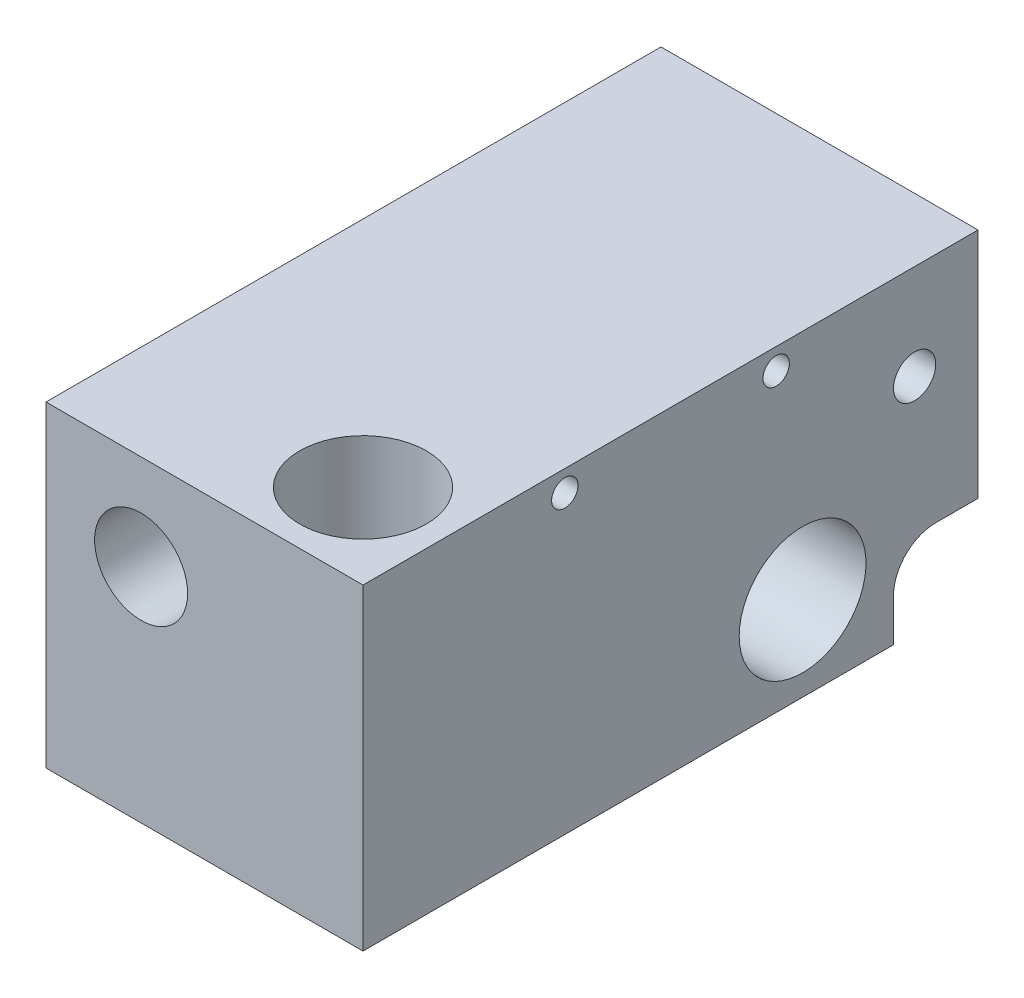
ISO-10303-21;
HEADER;
FILE_DESCRIPTION(('STEP AP214'),'2;1');
FILE_NAME('part.step','',(''),(''),'','','');
FILE_SCHEMA(('AUTOMOTIVE_DESIGN { 1 0 10303 214 1 1 1 1 }'));
ENDSEC;
DATA;
#1=APPLICATION_CONTEXT('core data for automotive mechanical design processes');
#2=APPLICATION_PROTOCOL_DEFINITION('international standard','automotive_design',2000,#1);
#3=PRODUCT_CONTEXT('',#1,'mechanical');
#4=PRODUCT('Part','Part','',(#3));
#5=PRODUCT_RELATED_PRODUCT_CATEGORY('part','',(#4));
#6=PRODUCT_DEFINITION_FORMATION('','',#4);
#7=PRODUCT_DEFINITION_CONTEXT('part definition',#1,'design');
#8=PRODUCT_DEFINITION('design','',#6,#7);
#9=PRODUCT_DEFINITION_SHAPE('','',#8);
#10=(LENGTH_UNIT() NAMED_UNIT(*) SI_UNIT(.MILLI.,.METRE.));
#11=(NAMED_UNIT(*) PLANE_ANGLE_UNIT() SI_UNIT($,.RADIAN.));
#12=(NAMED_UNIT(*) SI_UNIT($,.STERADIAN.) SOLID_ANGLE_UNIT());
#13=UNCERTAINTY_MEASURE_WITH_UNIT(LENGTH_MEASURE(1.E-05),#10,'distance_accuracy_value','');
#14=(GEOMETRIC_REPRESENTATION_CONTEXT(3) GLOBAL_UNCERTAINTY_ASSIGNED_CONTEXT((#13)) GLOBAL_UNIT_ASSIGNED_CONTEXT((#10,
#11,#12)) REPRESENTATION_CONTEXT('',''));
#15=CARTESIAN_POINT('',(0.,0.,0.));
#16=DIRECTION('',(0.,0.,1.));
#17=DIRECTION('',(1.,0.,0.));
#18=AXIS2_PLACEMENT_3D('',#15,#16,#17);
#19=CARTESIAN_POINT('',(30.00001,0.,58.2));
#20=DIRECTION('',(-1.,0.,0.));
#21=DIRECTION('',(0.,0.,1.));
#22=AXIS2_PLACEMENT_3D('',#19,#20,#21);
#23=PLANE('',#22);
#24=CARTESIAN_POINT('',(30.00001,8.,16.6));
#25=DIRECTION('',(-1.,0.,0.));
#26=DIRECTION('',(0.,0.,1.));
#27=AXIS2_PLACEMENT_3D('',#24,#25,#26);
#28=CIRCLE('',#27,6.);
#29=CARTESIAN_POINT('',(30.00001,8.,22.6));
#30=VERTEX_POINT('',#29);
#31=EDGE_CURVE('E373',#30,#30,#28,.F.);
#32=ORIENTED_EDGE('',*,*,#31,.F.);
#33=EDGE_LOOP('',(#32));
#34=FACE_BOUND('',#33,.T.);
#35=CARTESIAN_POINT('',(30.00001,4.,4.));
#36=DIRECTION('',(1.,0.,0.));
#37=DIRECTION('',(0.,0.,-1.));
#38=AXIS2_PLACEMENT_3D('',#35,#36,#37);
#39=CIRCLE('',#38,4.);
#40=CARTESIAN_POINT('',(30.00001,8.,4.));
#41=VERTEX_POINT('',#40);
#42=CARTESIAN_POINT('',(30.00001,4.,8.));
#43=VERTEX_POINT('',#42);
#44=EDGE_CURVE('E167',#41,#43,#39,.T.);
#45=ORIENTED_EDGE('',*,*,#44,.F.);
#46=DIRECTION('',(0.,0.,1.));
#47=VECTOR('',#46,1.);
#48=CARTESIAN_POINT('',(30.00001,8.,4.));
#49=LINE('',#48,#47);
#50=CARTESIAN_POINT('',(30.00001,8.,0.));
#51=VERTEX_POINT('',#50);
#52=EDGE_CURVE('E172',#51,#41,#49,.T.);
#53=ORIENTED_EDGE('',*,*,#52,.F.);
#54=DIRECTION('',(0.,1.,0.));
#55=VECTOR('',#54,1.);
#56=CARTESIAN_POINT('',(30.00001,0.,0.));
#57=LINE('',#56,#55);
#58=CARTESIAN_POINT('',(30.00001,30.00001,0.));
#59=VERTEX_POINT('',#58);
#60=EDGE_CURVE('E338',#51,#59,#57,.T.);
#61=ORIENTED_EDGE('',*,*,#60,.T.);
#62=DIRECTION('',(0.,0.,-1.));
#63=VECTOR('',#62,1.);
#64=CARTESIAN_POINT('',(30.00001,30.00001,58.2));
#65=LINE('',#64,#63);
#66=CARTESIAN_POINT('',(30.00001,30.00001,58.2));
#67=VERTEX_POINT('',#66);
#68=EDGE_CURVE('E353',#67,#59,#65,.T.);
#69=ORIENTED_EDGE('',*,*,#68,.F.);
#70=DIRECTION('',(0.,1.,0.));
#71=VECTOR('',#70,1.);
#72=CARTESIAN_POINT('',(30.00001,0.,58.2));
#73=LINE('',#72,#71);
#74=CARTESIAN_POINT('',(30.00001,0.,58.2));
#75=VERTEX_POINT('',#74);
#76=EDGE_CURVE('E383',#75,#67,#73,.T.);
#77=ORIENTED_EDGE('',*,*,#76,.F.);
#78=DIRECTION('',(0.,0.,-1.));
#79=VECTOR('',#78,1.);
#80=CARTESIAN_POINT('',(30.00001,0.,58.2));
#81=LINE('',#80,#79);
#82=CARTESIAN_POINT('',(30.00001,0.,8.));
#83=VERTEX_POINT('',#82);
#84=EDGE_CURVE('E46',#75,#83,#81,.T.);
#85=ORIENTED_EDGE('',*,*,#84,.T.);
#86=DIRECTION('',(0.,-1.,0.));
#87=VECTOR('',#86,1.);
#88=CARTESIAN_POINT('',(30.00001,0.,8.));
#89=LINE('',#88,#87);
#90=EDGE_CURVE('E183',#43,#83,#89,.T.);
#91=ORIENTED_EDGE('',*,*,#90,.F.);
#92=EDGE_LOOP('',(#45,#53,#61,#69,#77,#85,#91));
#93=FACE_BOUND('',#92,.T.);
#94=CARTESIAN_POINT('',(30.00001,21.00001,6.));
#95=DIRECTION('',(1.,0.,0.));
#96=DIRECTION('',(0.,0.,-1.));
#97=AXIS2_PLACEMENT_3D('',#94,#95,#96);
#98=CIRCLE('',#97,2.);
#99=CARTESIAN_POINT('',(30.00001,21.00001,4.));
#100=VERTEX_POINT('',#99);
#101=EDGE_CURVE('E218',#100,#100,#98,.T.);
#102=ORIENTED_EDGE('',*,*,#101,.F.);
#103=EDGE_LOOP('',(#102));
#104=FACE_BOUND('',#103,.T.);
#105=CARTESIAN_POINT('',(30.00001,28.00001,19.1));
#106=DIRECTION('',(1.,0.,0.));
#107=DIRECTION('',(0.,0.,-1.));
#108=AXIS2_PLACEMENT_3D('',#105,#106,#107);
#109=CIRCLE('',#108,1.24999999999999);
#110=CARTESIAN_POINT('',(30.00001,28.00001,17.85));
#111=VERTEX_POINT('',#110);
#112=EDGE_CURVE('E144',#111,#111,#109,.T.);
#113=ORIENTED_EDGE('',*,*,#112,.F.);
#114=EDGE_LOOP('',(#113));
#115=FACE_BOUND('',#114,.T.);
#116=CARTESIAN_POINT('',(30.00001,28.00001,39.1));
#117=DIRECTION('',(1.,0.,0.));
#118=DIRECTION('',(0.,0.,-1.));
#119=AXIS2_PLACEMENT_3D('',#116,#117,#118);
#120=CIRCLE('',#119,1.24999999999999);
#121=CARTESIAN_POINT('',(30.00001,28.00001,37.85));
#122=VERTEX_POINT('',#121);
#123=EDGE_CURVE('E145',#122,#122,#120,.T.);
#124=ORIENTED_EDGE('',*,*,#123,.F.);
#125=EDGE_LOOP('',(#124));
#126=FACE_BOUND('',#125,.T.);
#127=ADVANCED_FACE('F37',(#34,#93,#104,#115,#126),#23,.F.);
#128=CARTESIAN_POINT('',(0.,0.,58.2));
#129=DIRECTION('',(1.,0.,0.));
#130=DIRECTION('',(0.,0.,-1.));
#131=AXIS2_PLACEMENT_3D('',#128,#129,#130);
#132=PLANE('',#131);
#133=CARTESIAN_POINT('',(0.,8.,16.6));
#134=DIRECTION('',(-1.,0.,0.));
#135=DIRECTION('',(0.,0.,1.));
#136=AXIS2_PLACEMENT_3D('',#133,#134,#135);
#137=CIRCLE('',#136,6.);
#138=CARTESIAN_POINT('',(0.,8.,22.6));
#139=VERTEX_POINT('',#138);
#140=EDGE_CURVE('E364',#139,#139,#137,.T.);
#141=ORIENTED_EDGE('',*,*,#140,.F.);
#142=EDGE_LOOP('',(#141));
#143=FACE_BOUND('',#142,.T.);
#144=DIRECTION('',(0.,-1.,0.));
#145=VECTOR('',#144,1.);
#146=CARTESIAN_POINT('',(0.,0.,0.));
#147=LINE('',#146,#145);
#148=CARTESIAN_POINT('',(0.,30.00001,0.));
#149=VERTEX_POINT('',#148);
#150=CARTESIAN_POINT('',(0.,8.,0.));
#151=VERTEX_POINT('',#150);
#152=EDGE_CURVE('E339',#149,#151,#147,.T.);
#153=ORIENTED_EDGE('',*,*,#152,.T.);
#154=DIRECTION('',(0.,0.,-1.));
#155=VECTOR('',#154,1.);
#156=CARTESIAN_POINT('',(0.,8.,4.));
#157=LINE('',#156,#155);
#158=CARTESIAN_POINT('',(0.,8.,4.));
#159=VERTEX_POINT('',#158);
#160=EDGE_CURVE('E200',#159,#151,#157,.T.);
#161=ORIENTED_EDGE('',*,*,#160,.F.);
#162=CARTESIAN_POINT('',(0.,4.,4.));
#163=DIRECTION('',(-1.,0.,0.));
#164=DIRECTION('',(0.,0.,1.));
#165=AXIS2_PLACEMENT_3D('',#162,#163,#164);
#166=CIRCLE('',#165,4.);
#167=CARTESIAN_POINT('',(0.,4.,8.));
#168=VERTEX_POINT('',#167);
#169=EDGE_CURVE('E211',#168,#159,#166,.T.);
#170=ORIENTED_EDGE('',*,*,#169,.F.);
#171=DIRECTION('',(0.,1.,0.));
#172=VECTOR('',#171,1.);
#173=CARTESIAN_POINT('',(0.,0.,8.));
#174=LINE('',#173,#172);
#175=CARTESIAN_POINT('',(0.,0.,8.));
#176=VERTEX_POINT('',#175);
#177=EDGE_CURVE('E189',#176,#168,#174,.T.);
#178=ORIENTED_EDGE('',*,*,#177,.F.);
#179=DIRECTION('',(0.,0.,-1.));
#180=VECTOR('',#179,1.);
#181=CARTESIAN_POINT('',(0.,0.,58.2));
#182=LINE('',#181,#180);
#183=CARTESIAN_POINT('',(0.,0.,58.2));
#184=VERTEX_POINT('',#183);
#185=EDGE_CURVE('E11',#184,#176,#182,.T.);
#186=ORIENTED_EDGE('',*,*,#185,.F.);
#187=DIRECTION('',(0.,-1.,0.));
#188=VECTOR('',#187,1.);
#189=CARTESIAN_POINT('',(0.,0.,58.2));
#190=LINE('',#189,#188);
#191=CARTESIAN_POINT('',(0.,30.00001,58.2));
#192=VERTEX_POINT('',#191);
#193=EDGE_CURVE('E349',#192,#184,#190,.T.);
#194=ORIENTED_EDGE('',*,*,#193,.F.);
#195=DIRECTION('',(0.,0.,-1.));
#196=VECTOR('',#195,1.);
#197=CARTESIAN_POINT('',(0.,30.00001,58.2));
#198=LINE('',#197,#196);
#199=EDGE_CURVE('E350',#192,#149,#198,.T.);
#200=ORIENTED_EDGE('',*,*,#199,.T.);
#201=EDGE_LOOP('',(#153,#161,#170,#178,#186,#194,#200));
#202=FACE_BOUND('',#201,.T.);
#203=ADVANCED_FACE('F39',(#143,#202),#132,.F.);
#204=CARTESIAN_POINT('',(0.,0.,58.2));
#205=DIRECTION('',(0.,1.,0.));
#206=DIRECTION('',(0.,0.,1.));
#207=AXIS2_PLACEMENT_3D('',#204,#205,#206);
#208=PLANE('',#207);
#209=CARTESIAN_POINT('',(22.00001,0.,50.2));
#210=DIRECTION('',(0.,-1.,0.));
#211=DIRECTION('',(0.,0.,-1.));
#212=AXIS2_PLACEMENT_3D('',#209,#210,#211);
#213=CIRCLE('',#212,6.);
#214=CARTESIAN_POINT('',(22.00001,0.,44.2));
#215=VERTEX_POINT('',#214);
#216=EDGE_CURVE('E328',#215,#215,#213,.T.);
#217=ORIENTED_EDGE('',*,*,#216,.F.);
#218=EDGE_LOOP('',(#217));
#219=FACE_BOUND('',#218,.T.);
#220=DIRECTION('',(0.,0.,-1.));
#221=VECTOR('',#220,1.);
#222=CARTESIAN_POINT('',(20.00001,0.,0.));
#223=LINE('',#222,#221);
#224=CARTESIAN_POINT('',(20.00001,0.,8.));
#225=VERTEX_POINT('',#224);
#226=CARTESIAN_POINT('',(20.00001,0.,0.));
#227=VERTEX_POINT('',#226);
#228=EDGE_CURVE('E54',#225,#227,#223,.T.);
#229=ORIENTED_EDGE('',*,*,#228,.F.);
#230=DIRECTION('',(1.,0.,0.));
#231=VECTOR('',#230,1.);
#232=CARTESIAN_POINT('',(20.00001,0.,8.));
#233=LINE('',#232,#231);
#234=EDGE_CURVE('E192',#225,#83,#233,.T.);
#235=ORIENTED_EDGE('',*,*,#234,.T.);
#236=ORIENTED_EDGE('',*,*,#84,.F.);
#237=DIRECTION('',(1.,0.,0.));
#238=VECTOR('',#237,1.);
#239=CARTESIAN_POINT('',(0.,0.,58.2));
#240=LINE('',#239,#238);
#241=EDGE_CURVE('E381',#184,#75,#240,.T.);
#242=ORIENTED_EDGE('',*,*,#241,.F.);
#243=ORIENTED_EDGE('',*,*,#185,.T.);
#244=DIRECTION('',(-1.,0.,0.));
#245=VECTOR('',#244,1.);
#246=CARTESIAN_POINT('',(10.,0.,8.));
#247=LINE('',#246,#245);
#248=CARTESIAN_POINT('',(10.,0.,8.));
#249=VERTEX_POINT('',#248);
#250=EDGE_CURVE('E208',#249,#176,#247,.T.);
#251=ORIENTED_EDGE('',*,*,#250,.F.);
#252=DIRECTION('',(0.,0.,1.));
#253=VECTOR('',#252,1.);
#254=CARTESIAN_POINT('',(10.,0.,0.));
#255=LINE('',#254,#253);
#256=CARTESIAN_POINT('',(10.,0.,0.));
#257=VERTEX_POINT('',#256);
#258=EDGE_CURVE('E196',#257,#249,#255,.T.);
#259=ORIENTED_EDGE('',*,*,#258,.F.);
#260=DIRECTION('',(1.,0.,0.));
#261=VECTOR('',#260,1.);
#262=CARTESIAN_POINT('',(0.,0.,0.));
#263=LINE('',#262,#261);
#264=EDGE_CURVE('E334',#257,#227,#263,.T.);
#265=ORIENTED_EDGE('',*,*,#264,.T.);
#266=EDGE_LOOP('',(#229,#235,#236,#242,#243,#251,#259,#265));
#267=FACE_BOUND('',#266,.T.);
#268=ADVANCED_FACE('F311',(#219,#267),#208,.F.);
#269=CARTESIAN_POINT('',(0.,30.00001,58.2));
#270=DIRECTION('',(0.,-1.,0.));
#271=DIRECTION('',(0.,0.,-1.));
#272=AXIS2_PLACEMENT_3D('',#269,#270,#271);
#273=PLANE('',#272);
#274=CARTESIAN_POINT('',(22.00001,30.00001,50.2));
#275=DIRECTION('',(0.,-1.,0.));
#276=DIRECTION('',(0.,0.,-1.));
#277=AXIS2_PLACEMENT_3D('',#274,#275,#276);
#278=CIRCLE('',#277,6.);
#279=CARTESIAN_POINT('',(22.00001,30.00001,44.2));
#280=VERTEX_POINT('',#279);
#281=EDGE_CURVE('E344',#280,#280,#278,.F.);
#282=ORIENTED_EDGE('',*,*,#281,.F.);
#283=EDGE_LOOP('',(#282));
#284=FACE_BOUND('',#283,.T.);
#285=DIRECTION('',(-1.,0.,0.));
#286=VECTOR('',#285,1.);
#287=CARTESIAN_POINT('',(0.,30.00001,0.));
#288=LINE('',#287,#286);
#289=EDGE_CURVE('E341',#59,#149,#288,.T.);
#290=ORIENTED_EDGE('',*,*,#289,.T.);
#291=ORIENTED_EDGE('',*,*,#199,.F.);
#292=DIRECTION('',(-1.,0.,0.));
#293=VECTOR('',#292,1.);
#294=CARTESIAN_POINT('',(0.,30.00001,58.2));
#295=LINE('',#294,#293);
#296=EDGE_CURVE('E354',#67,#192,#295,.T.);
#297=ORIENTED_EDGE('',*,*,#296,.F.);
#298=ORIENTED_EDGE('',*,*,#68,.T.);
#299=EDGE_LOOP('',(#290,#291,#297,#298));
#300=FACE_BOUND('',#299,.T.);
#301=ADVANCED_FACE('F316',(#284,#300),#273,.F.);
#302=CARTESIAN_POINT('',(0.,0.,58.2));
#303=DIRECTION('',(0.,0.,-1.));
#304=DIRECTION('',(-1.,0.,0.));
#305=AXIS2_PLACEMENT_3D('',#302,#303,#304);
#306=PLANE('',#305);
#307=CARTESIAN_POINT('',(9.,21.00001,58.2));
#308=DIRECTION('',(0.,0.,1.));
#309=DIRECTION('',(1.,0.,0.));
#310=AXIS2_PLACEMENT_3D('',#307,#308,#309);
#311=CIRCLE('',#310,4.4);
#312=CARTESIAN_POINT('',(13.4,21.00001,58.2));
#313=VERTEX_POINT('',#312);
#314=EDGE_CURVE('E236',#313,#313,#311,.T.);
#315=ORIENTED_EDGE('',*,*,#314,.F.);
#316=EDGE_LOOP('',(#315));
#317=FACE_BOUND('',#316,.T.);
#318=ORIENTED_EDGE('',*,*,#193,.T.);
#319=ORIENTED_EDGE('',*,*,#241,.T.);
#320=ORIENTED_EDGE('',*,*,#76,.T.);
#321=ORIENTED_EDGE('',*,*,#296,.T.);
#322=EDGE_LOOP('',(#318,#319,#320,#321));
#323=FACE_BOUND('',#322,.T.);
#324=ADVANCED_FACE('F323',(#317,#323),#306,.F.);
#325=CARTESIAN_POINT('',(0.,0.,0.));
#326=DIRECTION('',(0.,0.,-1.));
#327=DIRECTION('',(-1.,0.,0.));
#328=AXIS2_PLACEMENT_3D('',#325,#326,#327);
#329=PLANE('',#328);
#330=DIRECTION('',(1.,0.,0.));
#331=VECTOR('',#330,1.);
#332=CARTESIAN_POINT('',(20.00001,8.,0.));
#333=LINE('',#332,#331);
#334=CARTESIAN_POINT('',(20.00001,8.,0.));
#335=VERTEX_POINT('',#334);
#336=EDGE_CURVE('E190',#335,#51,#333,.T.);
#337=ORIENTED_EDGE('',*,*,#336,.F.);
#338=DIRECTION('',(0.,1.,0.));
#339=VECTOR('',#338,1.);
#340=CARTESIAN_POINT('',(20.00001,8.,0.));
#341=LINE('',#340,#339);
#342=EDGE_CURVE('E175',#227,#335,#341,.T.);
#343=ORIENTED_EDGE('',*,*,#342,.F.);
#344=ORIENTED_EDGE('',*,*,#264,.F.);
#345=DIRECTION('',(0.,-1.,0.));
#346=VECTOR('',#345,1.);
#347=CARTESIAN_POINT('',(10.,8.,0.));
#348=LINE('',#347,#346);
#349=CARTESIAN_POINT('',(10.,8.,0.));
#350=VERTEX_POINT('',#349);
#351=EDGE_CURVE('E206',#350,#257,#348,.T.);
#352=ORIENTED_EDGE('',*,*,#351,.F.);
#353=DIRECTION('',(-1.,0.,0.));
#354=VECTOR('',#353,1.);
#355=CARTESIAN_POINT('',(10.,8.,0.));
#356=LINE('',#355,#354);
#357=EDGE_CURVE('E215',#350,#151,#356,.T.);
#358=ORIENTED_EDGE('',*,*,#357,.T.);
#359=ORIENTED_EDGE('',*,*,#152,.F.);
#360=ORIENTED_EDGE('',*,*,#289,.F.);
#361=ORIENTED_EDGE('',*,*,#60,.F.);
#362=EDGE_LOOP('',(#337,#343,#344,#352,#358,#359,#360,#361));
#363=FACE_BOUND('',#362,.T.);
#364=CARTESIAN_POINT('',(9.,21.00001,0.));
#365=DIRECTION('',(0.,0.,-1.));
#366=DIRECTION('',(-1.,0.,0.));
#367=AXIS2_PLACEMENT_3D('',#364,#365,#366);
#368=CIRCLE('',#367,7.);
#369=CARTESIAN_POINT('',(2.00000000000001,21.00001,0.));
#370=VERTEX_POINT('',#369);
#371=EDGE_CURVE('E359',#370,#370,#368,.T.);
#372=ORIENTED_EDGE('',*,*,#371,.F.);
#373=EDGE_LOOP('',(#372));
#374=FACE_BOUND('',#373,.T.);
#375=ADVANCED_FACE('F403',(#363,#374),#329,.T.);
#376=CARTESIAN_POINT('',(22.00001,30.00101,50.2));
#377=DIRECTION('',(0.,-1.,0.));
#378=DIRECTION('',(0.,0.,-1.));
#379=AXIS2_PLACEMENT_3D('',#376,#377,#378);
#380=CYLINDRICAL_SURFACE('',#379,6.);
#381=ORIENTED_EDGE('',*,*,#216,.T.);
#382=EDGE_LOOP('',(#381));
#383=FACE_BOUND('',#382,.T.);
#384=ORIENTED_EDGE('',*,*,#281,.T.);
#385=EDGE_LOOP('',(#384));
#386=FACE_BOUND('',#385,.T.);
#387=ADVANCED_FACE('F411',(#383,#386),#380,.F.);
#388=CARTESIAN_POINT('',(30.00101,8.,16.6));
#389=DIRECTION('',(-1.,0.,0.));
#390=DIRECTION('',(0.,0.,1.));
#391=AXIS2_PLACEMENT_3D('',#388,#389,#390);
#392=CYLINDRICAL_SURFACE('',#391,6.);
#393=ORIENTED_EDGE('',*,*,#140,.T.);
#394=EDGE_LOOP('',(#393));
#395=FACE_BOUND('',#394,.T.);
#396=ORIENTED_EDGE('',*,*,#31,.T.);
#397=EDGE_LOOP('',(#396));
#398=FACE_BOUND('',#397,.T.);
#399=ADVANCED_FACE('F417',(#395,#398),#392,.F.);
#400=CARTESIAN_POINT('',(9.,21.00001,20.));
#401=DIRECTION('',(0.,0.,-1.));
#402=DIRECTION('',(-1.,0.,0.));
#403=AXIS2_PLACEMENT_3D('',#400,#401,#402);
#404=CYLINDRICAL_SURFACE('',#403,7.);
#405=CARTESIAN_POINT('',(9.,21.00001,13.));
#406=DIRECTION('',(0.,0.,-1.));
#407=DIRECTION('',(-1.,0.,0.));
#408=AXIS2_PLACEMENT_3D('',#405,#406,#407);
#409=CIRCLE('',#408,7.);
#410=CARTESIAN_POINT('',(2.00000000000001,21.00001,13.));
#411=VERTEX_POINT('',#410);
#412=EDGE_CURVE('E158',#411,#411,#409,.T.);
#413=ORIENTED_EDGE('',*,*,#412,.F.);
#414=EDGE_LOOP('',(#413));
#415=FACE_BOUND('',#414,.T.);
#416=CARTESIAN_POINT('',(16.,21.00001,4.75000000000001));
#417=CARTESIAN_POINT('',(15.999998763976,21.0696297924423,4.75000272130109));
#418=CARTESIAN_POINT('',(15.9989506092859,21.1392856993994,4.75583595122519));
#419=CARTESIAN_POINT('',(15.9948702958792,21.2766387307757,4.77900208319116));
#420=CARTESIAN_POINT('',(15.9918363963652,21.3443340820549,4.79634507541894));
#421=CARTESIAN_POINT('',(15.9841243775337,21.4757593580017,4.84198611661903));
#422=CARTESIAN_POINT('',(15.9794476818814,21.5394926601173,4.87027468218421));
#423=CARTESIAN_POINT('',(15.9689623164939,21.6613014719942,4.93697784410854));
#424=CARTESIAN_POINT('',(15.963153755025,21.7193775220919,4.97539147209974));
#425=CARTESIAN_POINT('',(15.9509761623397,21.8288637216242,5.06169960650878));
#426=CARTESIAN_POINT('',(15.9446022102633,21.8802032101535,5.10968306493546));
#427=CARTESIAN_POINT('',(15.9320492430589,21.9741480566367,5.21357737476876));
#428=CARTESIAN_POINT('',(15.925870241183,22.016752821902,5.26948876368444));
#429=CARTESIAN_POINT('',(15.914359051213,22.0923080226427,5.38814505855674));
#430=CARTESIAN_POINT('',(15.9090332147643,22.1251874596852,5.45093584346199));
#431=CARTESIAN_POINT('',(15.899900262168,22.1799043908446,5.58126057933226));
#432=CARTESIAN_POINT('',(15.8960930277246,22.2017427450726,5.64879416036192));
#433=CARTESIAN_POINT('',(15.8904776555756,22.2335326352858,5.78593441070743));
#434=CARTESIAN_POINT('',(15.8886488979595,22.2436068678196,5.85551177757081));
#435=CARTESIAN_POINT('',(15.8871352851193,22.2519632029784,5.99539146100367));
#436=CARTESIAN_POINT('',(15.8874502556699,22.2502462638977,6.06569371819605));
#437=CARTESIAN_POINT('',(15.890169713885,22.2351686823677,6.20414444871828));
#438=CARTESIAN_POINT('',(15.8925492980011,22.2219468079752,6.27230859512712));
#439=CARTESIAN_POINT('',(15.8990908082447,22.1844528769305,6.40543531824928));
#440=CARTESIAN_POINT('',(15.9032528036882,22.1601803905301,6.47039777034269));
#441=CARTESIAN_POINT('',(15.9129166031172,22.1011363389819,6.59568723943462));
#442=CARTESIAN_POINT('',(15.9184256152135,22.0663080393802,6.65598694080444));
#443=CARTESIAN_POINT('',(15.930157853167,21.9871812010315,6.76993875110773));
#444=CARTESIAN_POINT('',(15.9363811449426,21.9428817879023,6.82359024554959));
#445=CARTESIAN_POINT('',(15.9489496550139,21.8453185445329,6.92352510889366));
#446=CARTESIAN_POINT('',(15.9552953462439,21.7919358557583,6.96969245898978));
#447=CARTESIAN_POINT('',(15.9673118680025,21.6781210007014,7.052433066454));
#448=CARTESIAN_POINT('',(15.9729826929038,21.6176887756456,7.08900624382515));
#449=CARTESIAN_POINT('',(15.9830204192952,21.4913745627051,7.15153451184813));
#450=CARTESIAN_POINT('',(15.9873859365503,21.4254868833463,7.17747834114894));
#451=CARTESIAN_POINT('',(15.9943103099852,21.290193700518,7.21789844109598));
#452=CARTESIAN_POINT('',(15.9968693399813,21.2207885361824,7.23237581503643));
#453=CARTESIAN_POINT('',(15.9998687531765,21.0814294926909,7.24929242302251));
#454=CARTESIAN_POINT('',(16.0003371346124,21.0114955085287,7.25189075427401));
#455=CARTESIAN_POINT('',(15.999179526896,20.8721920188695,7.24540113011834));
#456=CARTESIAN_POINT('',(15.9975536307163,20.8028224884518,7.23631369348605));
#457=CARTESIAN_POINT('',(15.9924075417281,20.66711584506,7.20684280075484));
#458=CARTESIAN_POINT('',(15.9889007253025,20.6007608649034,7.1865390803911));
#459=CARTESIAN_POINT('',(15.9803843661385,20.4723966666527,7.13529768490728));
#460=CARTESIAN_POINT('',(15.9753747289523,20.4103877219959,7.10435934141559));
#461=CARTESIAN_POINT('',(15.9643386693414,20.2917914502429,7.03236938854381));
#462=CARTESIAN_POINT('',(15.9583025668886,20.2352646357347,6.99121960423009));
#463=CARTESIAN_POINT('',(15.9459098401571,20.1298616850549,6.90010867446923));
#464=CARTESIAN_POINT('',(15.9395531889444,20.0809861932048,6.85014678770327));
#465=CARTESIAN_POINT('',(15.92714394563,19.9916752537134,6.74211251537622));
#466=CARTESIAN_POINT('',(15.921095907609,19.9513479143917,6.68395014956642));
#467=CARTESIAN_POINT('',(15.9100773332214,19.881035864613,6.5615831552756));
#468=CARTESIAN_POINT('',(15.9051067592469,19.8510507931479,6.49737873779858));
#469=CARTESIAN_POINT('',(15.8968409518192,19.8024314690129,6.36503691257965));
#470=CARTESIAN_POINT('',(15.8935381388008,19.7837457853768,6.29691889459094));
#471=CARTESIAN_POINT('',(15.8889637212046,19.7580955205428,6.15844635242687));
#472=CARTESIAN_POINT('',(15.8876919110174,19.7511297528707,6.08809205537764));
#473=CARTESIAN_POINT('',(15.8873332421708,19.7491538510974,5.94822539554926));
#474=CARTESIAN_POINT('',(15.8882152496387,19.7539733598233,5.87871546142907));
#475=CARTESIAN_POINT('',(15.8919961552361,19.7750602687845,5.74151309099096));
#476=CARTESIAN_POINT('',(15.8948950438823,19.7913276151932,5.67382064612895));
#477=CARTESIAN_POINT('',(15.9023705294021,19.8347794306733,5.54225506198331));
#478=CARTESIAN_POINT('',(15.9069445462846,19.8619471174264,5.47837622410696));
#479=CARTESIAN_POINT('',(15.9172570132202,19.9264103297163,5.35605578028163));
#480=CARTESIAN_POINT('',(15.9229955348359,19.9637064777275,5.2976145088108));
#481=CARTESIAN_POINT('',(15.935087988823,20.0479671628561,5.18697147630499));
#482=CARTESIAN_POINT('',(15.941449229514,20.0950562942225,5.13486538412839));
#483=CARTESIAN_POINT('',(15.9540141217659,20.1973050013699,5.03923709701689));
#484=CARTESIAN_POINT('',(15.9602177367425,20.2524664309804,4.99571687926136));
#485=CARTESIAN_POINT('',(15.9718267339403,20.3698246266987,4.91817111610559));
#486=CARTESIAN_POINT('',(15.9772252842142,20.4320744811647,4.88422487030421));
#487=CARTESIAN_POINT('',(15.9865493556256,20.5614675799048,4.82732539835364));
#488=CARTESIAN_POINT('',(15.9904762967291,20.6286060320217,4.80436156925121));
#489=CARTESIAN_POINT('',(15.9955889867874,20.7466441222541,4.77488469330197));
#490=CARTESIAN_POINT('',(15.9972339985932,20.7968425661642,4.76556843153165));
#491=CARTESIAN_POINT('',(15.9994399462622,20.8980242239805,4.75312515479815));
#492=CARTESIAN_POINT('',(16.0000009054956,20.9490074209452,4.74999800640927));
#493=CARTESIAN_POINT('',(16.,21.00001,4.75000000000001));
#494=B_SPLINE_CURVE_WITH_KNOTS('',3,(#416,#417,#418,#419,#420,#421,#422,#423,#424,#425,#426,
#427,#428,#429,#430,#431,#432,#433,#434,#435,#436,#437,#438,#439,#440,#441,#442,#443,#444,#445,
#446,#447,#448,#449,#450,#451,#452,#453,#454,#455,#456,#457,#458,#459,#460,#461,#462,#463,#464,
#465,#466,#467,#468,#469,#470,#471,#472,#473,#474,#475,#476,#477,#478,#479,#480,#481,#482,#483,
#484,#485,#486,#487,#488,#489,#490,#491,#492,#493),.UNSPECIFIED.,.T.,.F.,(4,2,2,2,2,2,2,2,2,2,2,
2,2,2,2,2,2,2,2,2,2,2,2,2,2,2,2,2,2,2,2,2,2,2,2,2,2,2,4),(0.,0.208672898370811,
0.417528974687012,0.626204498745019,0.834860072169512,1.04555398394513,1.2562621874814,
1.46847268234668,1.680666643261,1.89062713379412,2.10057056058127,2.30801629213299,
2.51547009175176,2.7240592869755,2.93266774767274,3.14425188945736,3.35583779539069,
3.56764729168081,3.77943640533439,3.98838053310804,4.19731538539157,4.40478370072618,
4.61226505754753,4.82182420244062,5.03140098492945,5.24348810388939,5.45556781896713,
5.66667480743358,5.87776042304785,6.08581286176571,6.29386432224864,6.5015966854302,
6.70934181830649,6.91991234386759,7.13053130374623,7.34284672270058,7.55495674626045,
7.70783116702339,7.86070229206404),.UNSPECIFIED.);
#495=CARTESIAN_POINT('',(16.,21.00001,4.75000000000001));
#496=VERTEX_POINT('',#495);
#497=EDGE_CURVE('E229',#496,#496,#494,.T.);
#498=ORIENTED_EDGE('',*,*,#497,.T.);
#499=EDGE_LOOP('',(#498));
#500=FACE_BOUND('',#499,.T.);
#501=ORIENTED_EDGE('',*,*,#371,.T.);
#502=EDGE_LOOP('',(#501));
#503=FACE_BOUND('',#502,.T.);
#504=ADVANCED_FACE('F414',(#415,#500,#503),#404,.F.);
#505=CARTESIAN_POINT('',(9.,21.00001,58.2));
#506=DIRECTION('',(0.,0.,1.));
#507=DIRECTION('',(1.,0.,0.));
#508=AXIS2_PLACEMENT_3D('',#505,#506,#507);
#509=CYLINDRICAL_SURFACE('',#508,2.99999999999999);
#510=CARTESIAN_POINT('',(9.,21.00001,47.3587951333614));
#511=DIRECTION('',(0.,0.,1.));
#512=DIRECTION('',(1.,0.,0.));
#513=AXIS2_PLACEMENT_3D('',#510,#511,#512);
#514=CIRCLE('',#513,2.99999999999999);
#515=CARTESIAN_POINT('',(12.,21.00001,47.3587951333614));
#516=VERTEX_POINT('',#515);
#517=EDGE_CURVE('E357',#516,#516,#514,.T.);
#518=ORIENTED_EDGE('',*,*,#517,.T.);
#519=EDGE_LOOP('',(#518));
#520=FACE_BOUND('',#519,.T.);
#521=CARTESIAN_POINT('',(9.,21.00001,13.));
#522=DIRECTION('',(0.,0.,-1.));
#523=DIRECTION('',(-1.,0.,0.));
#524=AXIS2_PLACEMENT_3D('',#521,#522,#523);
#525=CIRCLE('',#524,2.99999999999999);
#526=CARTESIAN_POINT('',(6.00000000000001,21.00001,13.));
#527=VERTEX_POINT('',#526);
#528=EDGE_CURVE('E155',#527,#527,#525,.T.);
#529=ORIENTED_EDGE('',*,*,#528,.T.);
#530=EDGE_LOOP('',(#529));
#531=FACE_BOUND('',#530,.T.);
#532=ADVANCED_FACE('F416',(#520,#531),#509,.F.);
#533=CARTESIAN_POINT('',(9.,21.00001,48.2));
#534=DIRECTION('',(0.,0.,1.));
#535=DIRECTION('',(1.,0.,0.));
#536=AXIS2_PLACEMENT_3D('',#533,#534,#535);
#537=CONICAL_SURFACE('',#536,4.4,1.02974425867665);
#538=CARTESIAN_POINT('',(9.,21.00001,48.2));
#539=DIRECTION('',(0.,0.,1.));
#540=DIRECTION('',(1.,0.,0.));
#541=AXIS2_PLACEMENT_3D('',#538,#539,#540);
#542=CIRCLE('',#541,4.4);
#543=CARTESIAN_POINT('',(13.4,21.00001,48.2));
#544=VERTEX_POINT('',#543);
#545=EDGE_CURVE('E360',#544,#544,#542,.T.);
#546=ORIENTED_EDGE('',*,*,#545,.T.);
#547=EDGE_LOOP('',(#546));
#548=FACE_BOUND('',#547,.T.);
#549=ORIENTED_EDGE('',*,*,#517,.F.);
#550=EDGE_LOOP('',(#549));
#551=FACE_BOUND('',#550,.T.);
#552=ADVANCED_FACE('F424',(#548,#551),#537,.F.);
#553=CARTESIAN_POINT('',(9.,21.00001,58.2));
#554=DIRECTION('',(0.,0.,1.));
#555=DIRECTION('',(1.,0.,0.));
#556=AXIS2_PLACEMENT_3D('',#553,#554,#555);
#557=CYLINDRICAL_SURFACE('',#556,4.4);
#558=ORIENTED_EDGE('',*,*,#545,.F.);
#559=EDGE_LOOP('',(#558));
#560=FACE_BOUND('',#559,.T.);
#561=ORIENTED_EDGE('',*,*,#314,.T.);
#562=EDGE_LOOP('',(#561));
#563=FACE_BOUND('',#562,.T.);
#564=ADVANCED_FACE('F245',(#560,#563),#557,.F.);
#565=CARTESIAN_POINT('',(30.00001,21.00001,6.));
#566=DIRECTION('',(1.,0.,0.));
#567=DIRECTION('',(0.,0.,-1.));
#568=AXIS2_PLACEMENT_3D('',#565,#566,#567);
#569=CYLINDRICAL_SURFACE('',#568,1.24999999999999);
#570=CARTESIAN_POINT('',(21.5493645357293,21.00001,6.));
#571=DIRECTION('',(1.,0.,0.));
#572=DIRECTION('',(0.,0.,-1.));
#573=AXIS2_PLACEMENT_3D('',#570,#571,#572);
#574=CIRCLE('',#573,1.24999999999999);
#575=CARTESIAN_POINT('',(21.5493645357293,21.00001,4.75000000000001));
#576=VERTEX_POINT('',#575);
#577=EDGE_CURVE('E41',#576,#576,#574,.T.);
#578=ORIENTED_EDGE('',*,*,#577,.T.);
#579=EDGE_LOOP('',(#578));
#580=FACE_BOUND('',#579,.T.);
#581=ORIENTED_EDGE('',*,*,#497,.F.);
#582=EDGE_LOOP('',(#581));
#583=FACE_BOUND('',#582,.T.);
#584=ADVANCED_FACE('F240',(#580,#583),#569,.F.);
#585=CARTESIAN_POINT('',(22.00001,21.00001,6.));
#586=DIRECTION('',(1.,0.,0.));
#587=DIRECTION('',(0.,0.,-1.));
#588=AXIS2_PLACEMENT_3D('',#585,#586,#587);
#589=CONICAL_SURFACE('',#588,2.,1.02974425867665);
#590=CARTESIAN_POINT('',(22.00001,21.00001,6.));
#591=DIRECTION('',(1.,0.,0.));
#592=DIRECTION('',(0.,0.,-1.));
#593=AXIS2_PLACEMENT_3D('',#590,#591,#592);
#594=CIRCLE('',#593,2.);
#595=CARTESIAN_POINT('',(22.00001,21.00001,4.));
#596=VERTEX_POINT('',#595);
#597=EDGE_CURVE('E226',#596,#596,#594,.T.);
#598=ORIENTED_EDGE('',*,*,#597,.T.);
#599=EDGE_LOOP('',(#598));
#600=FACE_BOUND('',#599,.T.);
#601=ORIENTED_EDGE('',*,*,#577,.F.);
#602=EDGE_LOOP('',(#601));
#603=FACE_BOUND('',#602,.T.);
#604=ADVANCED_FACE('F244',(#600,#603),#589,.F.);
#605=CARTESIAN_POINT('',(30.00001,21.00001,6.));
#606=DIRECTION('',(1.,0.,0.));
#607=DIRECTION('',(0.,0.,-1.));
#608=AXIS2_PLACEMENT_3D('',#605,#606,#607);
#609=CYLINDRICAL_SURFACE('',#608,2.);
#610=ORIENTED_EDGE('',*,*,#597,.F.);
#611=EDGE_LOOP('',(#610));
#612=FACE_BOUND('',#611,.T.);
#613=ORIENTED_EDGE('',*,*,#101,.T.);
#614=EDGE_LOOP('',(#613));
#615=FACE_BOUND('',#614,.T.);
#616=ADVANCED_FACE('F249',(#612,#615),#609,.F.);
#617=CARTESIAN_POINT('',(10.,8.,4.));
#618=DIRECTION('',(0.,1.,0.));
#619=DIRECTION('',(0.,0.,1.));
#620=AXIS2_PLACEMENT_3D('',#617,#618,#619);
#621=PLANE('',#620);
#622=ORIENTED_EDGE('',*,*,#160,.T.);
#623=ORIENTED_EDGE('',*,*,#357,.F.);
#624=DIRECTION('',(0.,0.,-1.));
#625=VECTOR('',#624,1.);
#626=CARTESIAN_POINT('',(10.,8.,4.));
#627=LINE('',#626,#625);
#628=CARTESIAN_POINT('',(10.,8.,4.));
#629=VERTEX_POINT('',#628);
#630=EDGE_CURVE('E62',#629,#350,#627,.T.);
#631=ORIENTED_EDGE('',*,*,#630,.F.);
#632=DIRECTION('',(-1.,0.,0.));
#633=VECTOR('',#632,1.);
#634=CARTESIAN_POINT('',(10.,8.,4.));
#635=LINE('',#634,#633);
#636=EDGE_CURVE('E219',#629,#159,#635,.T.);
#637=ORIENTED_EDGE('',*,*,#636,.T.);
#638=EDGE_LOOP('',(#622,#623,#631,#637));
#639=FACE_BOUND('',#638,.T.);
#640=ADVANCED_FACE('F253',(#639),#621,.F.);
#641=CARTESIAN_POINT('',(10.,4.,4.));
#642=DIRECTION('',(-1.,0.,0.));
#643=DIRECTION('',(0.,0.,1.));
#644=AXIS2_PLACEMENT_3D('',#641,#642,#643);
#645=CYLINDRICAL_SURFACE('',#644,4.);
#646=ORIENTED_EDGE('',*,*,#169,.T.);
#647=ORIENTED_EDGE('',*,*,#636,.F.);
#648=CARTESIAN_POINT('',(10.,4.,4.));
#649=DIRECTION('',(-1.,0.,0.));
#650=DIRECTION('',(0.,0.,1.));
#651=AXIS2_PLACEMENT_3D('',#648,#649,#650);
#652=CIRCLE('',#651,4.);
#653=CARTESIAN_POINT('',(10.,4.,8.));
#654=VERTEX_POINT('',#653);
#655=EDGE_CURVE('E203',#654,#629,#652,.T.);
#656=ORIENTED_EDGE('',*,*,#655,.F.);
#657=DIRECTION('',(-1.,0.,0.));
#658=VECTOR('',#657,1.);
#659=CARTESIAN_POINT('',(10.,4.,8.));
#660=LINE('',#659,#658);
#661=EDGE_CURVE('E221',#654,#168,#660,.T.);
#662=ORIENTED_EDGE('',*,*,#661,.T.);
#663=EDGE_LOOP('',(#646,#647,#656,#662));
#664=FACE_BOUND('',#663,.T.);
#665=ADVANCED_FACE('F259',(#664),#645,.F.);
#666=CARTESIAN_POINT('',(10.,0.,8.));
#667=DIRECTION('',(0.,0.,1.));
#668=DIRECTION('',(1.,0.,0.));
#669=AXIS2_PLACEMENT_3D('',#666,#667,#668);
#670=PLANE('',#669);
#671=ORIENTED_EDGE('',*,*,#177,.T.);
#672=ORIENTED_EDGE('',*,*,#661,.F.);
#673=DIRECTION('',(0.,1.,0.));
#674=VECTOR('',#673,1.);
#675=CARTESIAN_POINT('',(10.,0.,8.));
#676=LINE('',#675,#674);
#677=EDGE_CURVE('E199',#249,#654,#676,.T.);
#678=ORIENTED_EDGE('',*,*,#677,.F.);
#679=ORIENTED_EDGE('',*,*,#250,.T.);
#680=EDGE_LOOP('',(#671,#672,#678,#679));
#681=FACE_BOUND('',#680,.T.);
#682=ADVANCED_FACE('F255',(#681),#670,.F.);
#683=CARTESIAN_POINT('',(10.,4.,4.));
#684=DIRECTION('',(-1.,0.,0.));
#685=DIRECTION('',(0.,0.,1.));
#686=AXIS2_PLACEMENT_3D('',#683,#684,#685);
#687=PLANE('',#686);
#688=CARTESIAN_POINT('',(10.,3.6,3.6));
#689=DIRECTION('',(-1.,0.,0.));
#690=DIRECTION('',(0.,0.,1.));
#691=AXIS2_PLACEMENT_3D('',#688,#689,#690);
#692=CIRCLE('',#691,1.6);
#693=CARTESIAN_POINT('',(10.,3.6,5.2));
#694=VERTEX_POINT('',#693);
#695=EDGE_CURVE('E161',#694,#694,#692,.T.);
#696=ORIENTED_EDGE('',*,*,#695,.F.);
#697=EDGE_LOOP('',(#696));
#698=FACE_BOUND('',#697,.T.);
#699=ORIENTED_EDGE('',*,*,#258,.T.);
#700=ORIENTED_EDGE('',*,*,#677,.T.);
#701=ORIENTED_EDGE('',*,*,#655,.T.);
#702=ORIENTED_EDGE('',*,*,#630,.T.);
#703=ORIENTED_EDGE('',*,*,#351,.T.);
#704=EDGE_LOOP('',(#699,#700,#701,#702,#703));
#705=FACE_BOUND('',#704,.T.);
#706=ADVANCED_FACE('F258',(#698,#705),#687,.T.);
#707=CARTESIAN_POINT('',(20.00001,4.,4.));
#708=DIRECTION('',(1.,0.,0.));
#709=DIRECTION('',(0.,0.,-1.));
#710=AXIS2_PLACEMENT_3D('',#707,#708,#709);
#711=CYLINDRICAL_SURFACE('',#710,4.);
#712=ORIENTED_EDGE('',*,*,#44,.T.);
#713=DIRECTION('',(1.,0.,0.));
#714=VECTOR('',#713,1.);
#715=CARTESIAN_POINT('',(20.00001,4.,8.));
#716=LINE('',#715,#714);
#717=CARTESIAN_POINT('',(20.00001,4.,8.));
#718=VERTEX_POINT('',#717);
#719=EDGE_CURVE('E180',#718,#43,#716,.T.);
#720=ORIENTED_EDGE('',*,*,#719,.F.);
#721=CARTESIAN_POINT('',(20.00001,4.,4.));
#722=DIRECTION('',(1.,0.,0.));
#723=DIRECTION('',(0.,0.,-1.));
#724=AXIS2_PLACEMENT_3D('',#721,#722,#723);
#725=CIRCLE('',#724,4.);
#726=CARTESIAN_POINT('',(20.00001,8.,4.));
#727=VERTEX_POINT('',#726);
#728=EDGE_CURVE('E168',#727,#718,#725,.T.);
#729=ORIENTED_EDGE('',*,*,#728,.F.);
#730=DIRECTION('',(1.,0.,0.));
#731=VECTOR('',#730,1.);
#732=CARTESIAN_POINT('',(20.00001,8.,4.));
#733=LINE('',#732,#731);
#734=EDGE_CURVE('E187',#727,#41,#733,.T.);
#735=ORIENTED_EDGE('',*,*,#734,.T.);
#736=EDGE_LOOP('',(#712,#720,#729,#735));
#737=FACE_BOUND('',#736,.T.);
#738=ADVANCED_FACE('F269',(#737),#711,.F.);
#739=CARTESIAN_POINT('',(20.00001,8.,4.));
#740=DIRECTION('',(0.,1.,0.));
#741=DIRECTION('',(0.,0.,1.));
#742=AXIS2_PLACEMENT_3D('',#739,#740,#741);
#743=PLANE('',#742);
#744=ORIENTED_EDGE('',*,*,#52,.T.);
#745=ORIENTED_EDGE('',*,*,#734,.F.);
#746=DIRECTION('',(0.,0.,1.));
#747=VECTOR('',#746,1.);
#748=CARTESIAN_POINT('',(20.00001,8.,4.));
#749=LINE('',#748,#747);
#750=EDGE_CURVE('E177',#335,#727,#749,.T.);
#751=ORIENTED_EDGE('',*,*,#750,.F.);
#752=ORIENTED_EDGE('',*,*,#336,.T.);
#753=EDGE_LOOP('',(#744,#745,#751,#752));
#754=FACE_BOUND('',#753,.T.);
#755=ADVANCED_FACE('F273',(#754),#743,.F.);
#756=CARTESIAN_POINT('',(20.00001,0.,8.));
#757=DIRECTION('',(0.,0.,1.));
#758=DIRECTION('',(1.,0.,0.));
#759=AXIS2_PLACEMENT_3D('',#756,#757,#758);
#760=PLANE('',#759);
#761=ORIENTED_EDGE('',*,*,#90,.T.);
#762=ORIENTED_EDGE('',*,*,#234,.F.);
#763=DIRECTION('',(0.,-1.,0.));
#764=VECTOR('',#763,1.);
#765=CARTESIAN_POINT('',(20.00001,0.,8.));
#766=LINE('',#765,#764);
#767=EDGE_CURVE('E171',#718,#225,#766,.T.);
#768=ORIENTED_EDGE('',*,*,#767,.F.);
#769=ORIENTED_EDGE('',*,*,#719,.T.);
#770=EDGE_LOOP('',(#761,#762,#768,#769));
#771=FACE_BOUND('',#770,.T.);
#772=ADVANCED_FACE('F275',(#771),#760,.F.);
#773=CARTESIAN_POINT('',(20.00001,4.,4.));
#774=DIRECTION('',(1.,0.,0.));
#775=DIRECTION('',(0.,0.,-1.));
#776=AXIS2_PLACEMENT_3D('',#773,#774,#775);
#777=PLANE('',#776);
#778=CARTESIAN_POINT('',(20.00001,3.6,3.6));
#779=DIRECTION('',(1.,0.,0.));
#780=DIRECTION('',(0.,0.,-1.));
#781=AXIS2_PLACEMENT_3D('',#778,#779,#780);
#782=CIRCLE('',#781,1.6);
#783=CARTESIAN_POINT('',(20.00001,3.6,2.));
#784=VERTEX_POINT('',#783);
#785=EDGE_CURVE('E164',#784,#784,#782,.F.);
#786=ORIENTED_EDGE('',*,*,#785,.T.);
#787=EDGE_LOOP('',(#786));
#788=FACE_BOUND('',#787,.T.);
#789=ORIENTED_EDGE('',*,*,#728,.T.);
#790=ORIENTED_EDGE('',*,*,#767,.T.);
#791=ORIENTED_EDGE('',*,*,#228,.T.);
#792=ORIENTED_EDGE('',*,*,#342,.T.);
#793=ORIENTED_EDGE('',*,*,#750,.T.);
#794=EDGE_LOOP('',(#789,#790,#791,#792,#793));
#795=FACE_BOUND('',#794,.T.);
#796=ADVANCED_FACE('F278',(#788,#795),#777,.T.);
#797=CARTESIAN_POINT('',(24.5254933995939,3.6,3.6));
#798=DIRECTION('',(-1.,0.,0.));
#799=DIRECTION('',(0.,0.,1.));
#800=AXIS2_PLACEMENT_3D('',#797,#798,#799);
#801=CYLINDRICAL_SURFACE('',#800,1.6);
#802=ORIENTED_EDGE('',*,*,#695,.T.);
#803=EDGE_LOOP('',(#802));
#804=FACE_BOUND('',#803,.T.);
#805=ORIENTED_EDGE('',*,*,#785,.F.);
#806=EDGE_LOOP('',(#805));
#807=FACE_BOUND('',#806,.T.);
#808=ADVANCED_FACE('F285',(#804,#807),#801,.F.);
#809=CARTESIAN_POINT('',(9.,21.00001,13.));
#810=DIRECTION('',(0.,0.,-1.));
#811=DIRECTION('',(-1.,0.,0.));
#812=AXIS2_PLACEMENT_3D('',#809,#810,#811);
#813=PLANE('',#812);
#814=ORIENTED_EDGE('',*,*,#412,.T.);
#815=EDGE_LOOP('',(#814));
#816=FACE_BOUND('',#815,.T.);
#817=ORIENTED_EDGE('',*,*,#528,.F.);
#818=EDGE_LOOP('',(#817));
#819=FACE_BOUND('',#818,.T.);
#820=ADVANCED_FACE('F289',(#816,#819),#813,.T.);
#821=CARTESIAN_POINT('',(18.50001,28.00001,19.1));
#822=DIRECTION('',(1.,0.,0.));
#823=DIRECTION('',(0.,0.,-1.));
#824=AXIS2_PLACEMENT_3D('',#821,#822,#823);
#825=CONICAL_SURFACE('',#824,1.24999999999999,1.02974425867664);
#826=CARTESIAN_POINT('',(17.7489342262155,28.00001,19.1));
#827=VERTEX_POINT('',#826);
#828=VERTEX_LOOP('',#827);
#829=FACE_BOUND('',#828,.T.);
#830=CARTESIAN_POINT('',(18.50001,28.00001,19.1));
#831=DIRECTION('',(1.,0.,0.));
#832=DIRECTION('',(0.,0.,-1.));
#833=AXIS2_PLACEMENT_3D('',#830,#831,#832);
#834=CIRCLE('',#833,1.24999999999999);
#835=CARTESIAN_POINT('',(18.50001,28.00001,17.85));
#836=VERTEX_POINT('',#835);
#837=EDGE_CURVE('E148',#836,#836,#834,.T.);
#838=ORIENTED_EDGE('',*,*,#837,.T.);
#839=EDGE_LOOP('',(#838));
#840=FACE_BOUND('',#839,.T.);
#841=ADVANCED_FACE('F293',(#829,#840),#825,.F.);
#842=CARTESIAN_POINT('',(30.00001,28.00001,19.1));
#843=DIRECTION('',(1.,0.,0.));
#844=DIRECTION('',(0.,0.,-1.));
#845=AXIS2_PLACEMENT_3D('',#842,#843,#844);
#846=CYLINDRICAL_SURFACE('',#845,1.24999999999999);
#847=ORIENTED_EDGE('',*,*,#837,.F.);
#848=EDGE_LOOP('',(#847));
#849=FACE_BOUND('',#848,.T.);
#850=ORIENTED_EDGE('',*,*,#112,.T.);
#851=EDGE_LOOP('',(#850));
#852=FACE_BOUND('',#851,.T.);
#853=ADVANCED_FACE('F138',(#849,#852),#846,.F.);
#854=CARTESIAN_POINT('',(18.50001,28.00001,39.1));
#855=DIRECTION('',(1.,0.,0.));
#856=DIRECTION('',(0.,0.,-1.));
#857=AXIS2_PLACEMENT_3D('',#854,#855,#856);
#858=CONICAL_SURFACE('',#857,1.24999999999999,1.02974425867664);
#859=CARTESIAN_POINT('',(17.7489342262155,28.00001,39.1));
#860=VERTEX_POINT('',#859);
#861=VERTEX_LOOP('',#860);
#862=FACE_BOUND('',#861,.T.);
#863=CARTESIAN_POINT('',(18.50001,28.00001,39.1));
#864=DIRECTION('',(1.,0.,0.));
#865=DIRECTION('',(0.,0.,-1.));
#866=AXIS2_PLACEMENT_3D('',#863,#864,#865);
#867=CIRCLE('',#866,1.24999999999999);
#868=CARTESIAN_POINT('',(18.50001,28.00001,37.85));
#869=VERTEX_POINT('',#868);
#870=EDGE_CURVE('E142',#869,#869,#867,.T.);
#871=ORIENTED_EDGE('',*,*,#870,.T.);
#872=EDGE_LOOP('',(#871));
#873=FACE_BOUND('',#872,.T.);
#874=ADVANCED_FACE('F134',(#862,#873),#858,.F.);
#875=CARTESIAN_POINT('',(30.00001,28.00001,39.1));
#876=DIRECTION('',(1.,0.,0.));
#877=DIRECTION('',(0.,0.,-1.));
#878=AXIS2_PLACEMENT_3D('',#875,#876,#877);
#879=CYLINDRICAL_SURFACE('',#878,1.24999999999999);
#880=ORIENTED_EDGE('',*,*,#870,.F.);
#881=EDGE_LOOP('',(#880));
#882=FACE_BOUND('',#881,.T.);
#883=ORIENTED_EDGE('',*,*,#123,.T.);
#884=EDGE_LOOP('',(#883));
#885=FACE_BOUND('',#884,.T.);
#886=ADVANCED_FACE('F137',(#882,#885),#879,.F.);
#887=CLOSED_SHELL('',(#127,#203,#268,#301,#324,#375,#387,#399,#504,#532,#552,#564,#584,#604,
#616,#640,#665,#682,#706,#738,#755,#772,#796,#808,#820,#841,#853,#874,#886));
#888=MANIFOLD_SOLID_BREP('B2',#887);
#889=ADVANCED_BREP_SHAPE_REPRESENTATION('',(#18,#888),#14);
#890=SHAPE_DEFINITION_REPRESENTATION(#9,#889);
ENDSEC;
END-ISO-10303-21;
